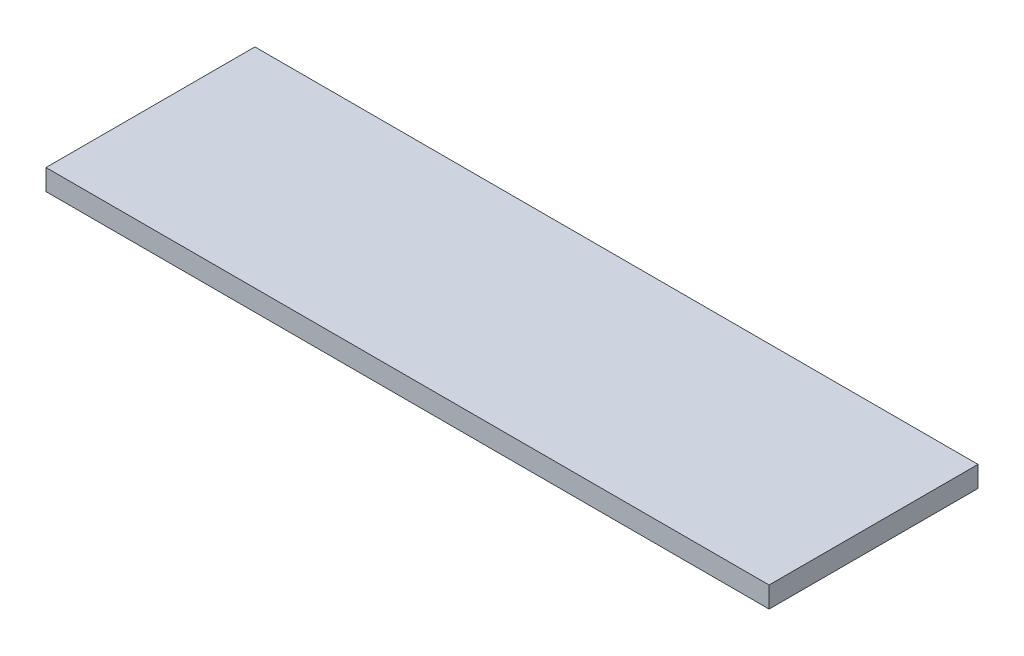
ISO-10303-21;
HEADER;
FILE_DESCRIPTION(('STEP AP214'),'2;1');
FILE_NAME('part.step','',(''),(''),'','','');
FILE_SCHEMA(('AUTOMOTIVE_DESIGN { 1 0 10303 214 1 1 1 1 }'));
ENDSEC;
DATA;
#1=APPLICATION_CONTEXT('core data for automotive mechanical design processes');
#2=APPLICATION_PROTOCOL_DEFINITION('international standard','automotive_design',2000,#1);
#3=PRODUCT_CONTEXT('',#1,'mechanical');
#4=PRODUCT('Part','Part','',(#3));
#5=PRODUCT_RELATED_PRODUCT_CATEGORY('part','',(#4));
#6=PRODUCT_DEFINITION_FORMATION('','',#4);
#7=PRODUCT_DEFINITION_CONTEXT('part definition',#1,'design');
#8=PRODUCT_DEFINITION('design','',#6,#7);
#9=PRODUCT_DEFINITION_SHAPE('','',#8);
#10=(LENGTH_UNIT() NAMED_UNIT(*) SI_UNIT(.MILLI.,.METRE.));
#11=(NAMED_UNIT(*) PLANE_ANGLE_UNIT() SI_UNIT($,.RADIAN.));
#12=(NAMED_UNIT(*) SI_UNIT($,.STERADIAN.) SOLID_ANGLE_UNIT());
#13=UNCERTAINTY_MEASURE_WITH_UNIT(LENGTH_MEASURE(1.E-05),#10,'distance_accuracy_value','');
#14=(GEOMETRIC_REPRESENTATION_CONTEXT(3) GLOBAL_UNCERTAINTY_ASSIGNED_CONTEXT((#13)) GLOBAL_UNIT_ASSIGNED_CONTEXT((#10,
#11,#12)) REPRESENTATION_CONTEXT('',''));
#15=CARTESIAN_POINT('',(0.,0.,0.));
#16=DIRECTION('',(0.,0.,1.));
#17=DIRECTION('',(1.,0.,0.));
#18=AXIS2_PLACEMENT_3D('',#15,#16,#17);
#19=CARTESIAN_POINT('',(18.6128315516283,2.,10.));
#20=DIRECTION('',(0.,0.,1.));
#21=DIRECTION('',(0.,-1.,0.));
#22=AXIS2_PLACEMENT_3D('',#19,#20,#21);
#23=PLANE('',#22);
#24=DIRECTION('',(1.,0.,0.));
#25=VECTOR('',#24,1.);
#26=CARTESIAN_POINT('',(19.6128315516283,0.,10.));
#27=LINE('',#26,#25);
#28=CARTESIAN_POINT('',(0.,0.,10.));
#29=VERTEX_POINT('',#28);
#30=CARTESIAN_POINT('',(34.6128315516283,0.,10.));
#31=VERTEX_POINT('',#30);
#32=EDGE_CURVE('E102',#29,#31,#27,.T.);
#33=ORIENTED_EDGE('',*,*,#32,.F.);
#34=DIRECTION('',(0.,1.,0.));
#35=VECTOR('',#34,1.);
#36=CARTESIAN_POINT('',(0.,-1.,10.));
#37=LINE('',#36,#35);
#38=CARTESIAN_POINT('',(0.,-1.,10.));
#39=VERTEX_POINT('',#38);
#40=EDGE_CURVE('E99',#39,#29,#37,.T.);
#41=ORIENTED_EDGE('',*,*,#40,.F.);
#42=DIRECTION('',(1.,0.,0.));
#43=VECTOR('',#42,1.);
#44=CARTESIAN_POINT('',(19.6128315516283,-1.,10.));
#45=LINE('',#44,#43);
#46=CARTESIAN_POINT('',(34.6128315516283,-1.,10.));
#47=VERTEX_POINT('',#46);
#48=EDGE_CURVE('E88',#39,#47,#45,.T.);
#49=ORIENTED_EDGE('',*,*,#48,.T.);
#50=DIRECTION('',(0.,-1.,0.));
#51=VECTOR('',#50,1.);
#52=CARTESIAN_POINT('',(34.6128315516283,0.,10.));
#53=LINE('',#52,#51);
#54=EDGE_CURVE('E91',#31,#47,#53,.T.);
#55=ORIENTED_EDGE('',*,*,#54,.F.);
#56=EDGE_LOOP('',(#33,#41,#49,#55));
#57=FACE_BOUND('',#56,.T.);
#58=ADVANCED_FACE('F44',(#57),#23,.T.);
#59=CARTESIAN_POINT('',(19.6128315516283,-1.,10.));
#60=DIRECTION('',(0.,1.,0.));
#61=DIRECTION('',(0.,0.,1.));
#62=AXIS2_PLACEMENT_3D('',#59,#60,#61);
#63=PLANE('',#62);
#64=DIRECTION('',(1.,0.,0.));
#65=VECTOR('',#64,1.);
#66=CARTESIAN_POINT('',(19.6128315516283,-1.,0.));
#67=LINE('',#66,#65);
#68=CARTESIAN_POINT('',(0.,-1.,0.));
#69=VERTEX_POINT('',#68);
#70=CARTESIAN_POINT('',(34.6128315516283,-1.,0.));
#71=VERTEX_POINT('',#70);
#72=EDGE_CURVE('E77',#69,#71,#67,.T.);
#73=ORIENTED_EDGE('',*,*,#72,.T.);
#74=DIRECTION('',(0.,0.,-1.));
#75=VECTOR('',#74,1.);
#76=CARTESIAN_POINT('',(34.6128315516283,-1.,10.));
#77=LINE('',#76,#75);
#78=EDGE_CURVE('E12',#47,#71,#77,.T.);
#79=ORIENTED_EDGE('',*,*,#78,.F.);
#80=ORIENTED_EDGE('',*,*,#48,.F.);
#81=DIRECTION('',(0.,0.,-1.));
#82=VECTOR('',#81,1.);
#83=CARTESIAN_POINT('',(0.,-1.,10.));
#84=LINE('',#83,#82);
#85=EDGE_CURVE('E90',#39,#69,#84,.T.);
#86=ORIENTED_EDGE('',*,*,#85,.T.);
#87=EDGE_LOOP('',(#73,#79,#80,#86));
#88=FACE_BOUND('',#87,.T.);
#89=ADVANCED_FACE('F86',(#88),#63,.F.);
#90=CARTESIAN_POINT('',(34.6128315516283,0.,10.));
#91=DIRECTION('',(1.,0.,0.));
#92=DIRECTION('',(0.,0.,1.));
#93=AXIS2_PLACEMENT_3D('',#90,#91,#92);
#94=PLANE('',#93);
#95=DIRECTION('',(0.,-1.,0.));
#96=VECTOR('',#95,1.);
#97=CARTESIAN_POINT('',(34.6128315516283,0.,0.));
#98=LINE('',#97,#96);
#99=CARTESIAN_POINT('',(34.6128315516283,0.,0.));
#100=VERTEX_POINT('',#99);
#101=EDGE_CURVE('E111',#100,#71,#98,.T.);
#102=ORIENTED_EDGE('',*,*,#101,.F.);
#103=DIRECTION('',(0.,0.,-1.));
#104=VECTOR('',#103,1.);
#105=CARTESIAN_POINT('',(34.6128315516283,0.,10.));
#106=LINE('',#105,#104);
#107=EDGE_CURVE('E53',#31,#100,#106,.T.);
#108=ORIENTED_EDGE('',*,*,#107,.F.);
#109=ORIENTED_EDGE('',*,*,#54,.T.);
#110=ORIENTED_EDGE('',*,*,#78,.T.);
#111=EDGE_LOOP('',(#102,#108,#109,#110));
#112=FACE_BOUND('',#111,.T.);
#113=ADVANCED_FACE('F118',(#112),#94,.T.);
#114=CARTESIAN_POINT('',(0.,0.,10.));
#115=DIRECTION('',(0.,1.,0.));
#116=DIRECTION('',(0.,0.,1.));
#117=AXIS2_PLACEMENT_3D('',#114,#115,#116);
#118=PLANE('',#117);
#119=DIRECTION('',(1.,0.,0.));
#120=VECTOR('',#119,1.);
#121=CARTESIAN_POINT('',(19.6128315516283,0.,0.));
#122=LINE('',#121,#120);
#123=CARTESIAN_POINT('',(0.,0.,0.));
#124=VERTEX_POINT('',#123);
#125=EDGE_CURVE('E94',#124,#100,#122,.T.);
#126=ORIENTED_EDGE('',*,*,#125,.F.);
#127=DIRECTION('',(0.,0.,-1.));
#128=VECTOR('',#127,1.);
#129=CARTESIAN_POINT('',(0.,0.,10.));
#130=LINE('',#129,#128);
#131=EDGE_CURVE('E106',#29,#124,#130,.T.);
#132=ORIENTED_EDGE('',*,*,#131,.F.);
#133=ORIENTED_EDGE('',*,*,#32,.T.);
#134=ORIENTED_EDGE('',*,*,#107,.T.);
#135=EDGE_LOOP('',(#126,#132,#133,#134));
#136=FACE_BOUND('',#135,.T.);
#137=ADVANCED_FACE('F50',(#136),#118,.T.);
#138=CARTESIAN_POINT('',(21.6128315516283,2.,0.));
#139=DIRECTION('',(0.,0.,-1.));
#140=DIRECTION('',(0.,1.,0.));
#141=AXIS2_PLACEMENT_3D('',#138,#139,#140);
#142=PLANE('',#141);
#143=ORIENTED_EDGE('',*,*,#72,.F.);
#144=DIRECTION('',(0.,1.,0.));
#145=VECTOR('',#144,1.);
#146=CARTESIAN_POINT('',(0.,-1.,0.));
#147=LINE('',#146,#145);
#148=EDGE_CURVE('E101',#69,#124,#147,.T.);
#149=ORIENTED_EDGE('',*,*,#148,.T.);
#150=ORIENTED_EDGE('',*,*,#125,.T.);
#151=ORIENTED_EDGE('',*,*,#101,.T.);
#152=EDGE_LOOP('',(#143,#149,#150,#151));
#153=FACE_BOUND('',#152,.T.);
#154=ADVANCED_FACE('F119',(#153),#142,.T.);
#155=CARTESIAN_POINT('',(0.,-1.,10.));
#156=DIRECTION('',(-1.,0.,0.));
#157=DIRECTION('',(0.,0.,1.));
#158=AXIS2_PLACEMENT_3D('',#155,#156,#157);
#159=PLANE('',#158);
#160=ORIENTED_EDGE('',*,*,#148,.F.);
#161=ORIENTED_EDGE('',*,*,#85,.F.);
#162=ORIENTED_EDGE('',*,*,#40,.T.);
#163=ORIENTED_EDGE('',*,*,#131,.T.);
#164=EDGE_LOOP('',(#160,#161,#162,#163));
#165=FACE_BOUND('',#164,.T.);
#166=ADVANCED_FACE('F98',(#165),#159,.T.);
#167=CLOSED_SHELL('',(#58,#89,#113,#137,#154,#166));
#168=MANIFOLD_SOLID_BREP('B2',#167);
#169=ADVANCED_BREP_SHAPE_REPRESENTATION('',(#18,#168),#14);
#170=SHAPE_DEFINITION_REPRESENTATION(#9,#169);
ENDSEC;
END-ISO-10303-21;
